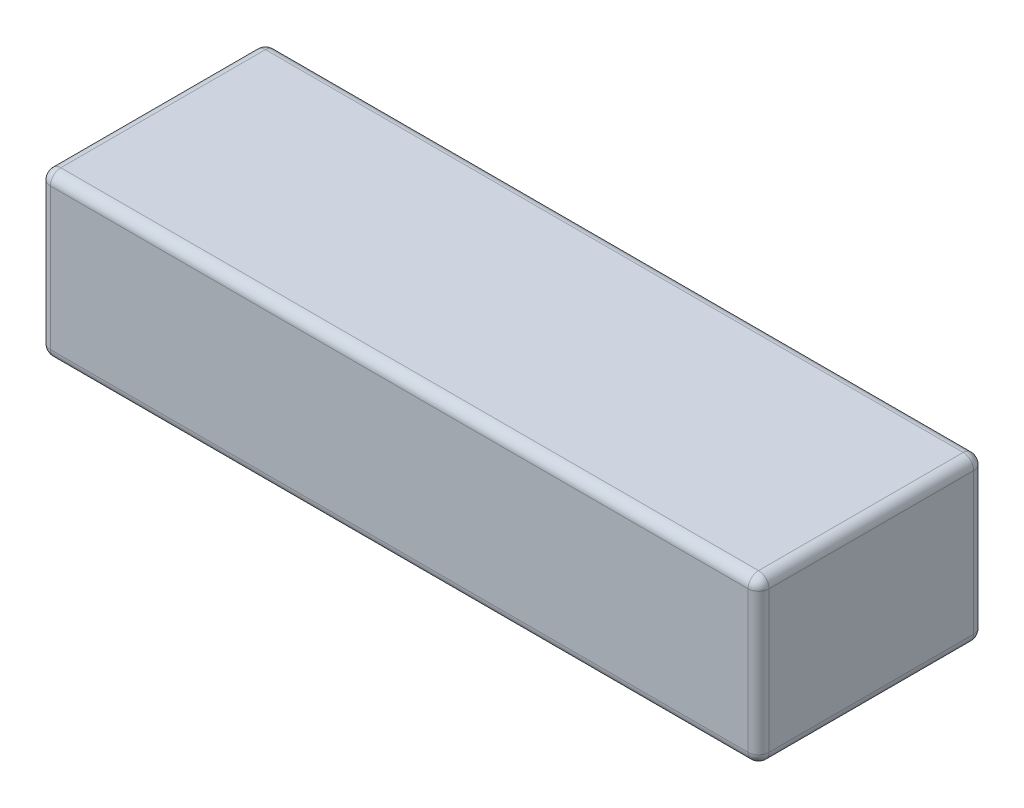
ISO-10303-21;
HEADER;
FILE_DESCRIPTION(('STEP AP214'),'2;1');
FILE_NAME('part.step','',(''),(''),'','','');
FILE_SCHEMA(('AUTOMOTIVE_DESIGN { 1 0 10303 214 1 1 1 1 }'));
ENDSEC;
DATA;
#1=APPLICATION_CONTEXT('core data for automotive mechanical design processes');
#2=APPLICATION_PROTOCOL_DEFINITION('international standard','automotive_design',2000,#1);
#3=PRODUCT_CONTEXT('',#1,'mechanical');
#4=PRODUCT('Part','Part','',(#3));
#5=PRODUCT_RELATED_PRODUCT_CATEGORY('part','',(#4));
#6=PRODUCT_DEFINITION_FORMATION('','',#4);
#7=PRODUCT_DEFINITION_CONTEXT('part definition',#1,'design');
#8=PRODUCT_DEFINITION('design','',#6,#7);
#9=PRODUCT_DEFINITION_SHAPE('','',#8);
#10=(LENGTH_UNIT() NAMED_UNIT(*) SI_UNIT(.MILLI.,.METRE.));
#11=(NAMED_UNIT(*) PLANE_ANGLE_UNIT() SI_UNIT($,.RADIAN.));
#12=(NAMED_UNIT(*) SI_UNIT($,.STERADIAN.) SOLID_ANGLE_UNIT());
#13=UNCERTAINTY_MEASURE_WITH_UNIT(LENGTH_MEASURE(1.E-05),#10,'distance_accuracy_value','');
#14=(GEOMETRIC_REPRESENTATION_CONTEXT(3) GLOBAL_UNCERTAINTY_ASSIGNED_CONTEXT((#13)) GLOBAL_UNIT_ASSIGNED_CONTEXT((#10,
#11,#12)) REPRESENTATION_CONTEXT('',''));
#15=CARTESIAN_POINT('',(0.,0.,0.));
#16=DIRECTION('',(0.,0.,1.));
#17=DIRECTION('',(1.,0.,0.));
#18=AXIS2_PLACEMENT_3D('',#15,#16,#17);
#19=CARTESIAN_POINT('',(0.,31.,0.));
#20=DIRECTION('',(1.,0.,0.));
#21=DIRECTION('',(0.,0.,-1.));
#22=AXIS2_PLACEMENT_3D('',#19,#20,#21);
#23=PLANE('',#22);
#24=DIRECTION('',(0.,-1.,0.));
#25=VECTOR('',#24,1.);
#26=CARTESIAN_POINT('',(0.,31.,-41.));
#27=LINE('',#26,#25);
#28=CARTESIAN_POINT('',(0.,29.,-41.));
#29=VERTEX_POINT('',#28);
#30=CARTESIAN_POINT('',(0.,2.,-41.));
#31=VERTEX_POINT('',#30);
#32=EDGE_CURVE('E186',#29,#31,#27,.T.);
#33=ORIENTED_EDGE('',*,*,#32,.T.);
#34=DIRECTION('',(0.,0.,1.));
#35=VECTOR('',#34,1.);
#36=CARTESIAN_POINT('',(0.,2.,0.));
#37=LINE('',#36,#35);
#38=CARTESIAN_POINT('',(0.,2.,-2.));
#39=VERTEX_POINT('',#38);
#40=EDGE_CURVE('E189',#31,#39,#37,.T.);
#41=ORIENTED_EDGE('',*,*,#40,.T.);
#42=DIRECTION('',(0.,-1.,0.));
#43=VECTOR('',#42,1.);
#44=CARTESIAN_POINT('',(0.,31.,-2.));
#45=LINE('',#44,#43);
#46=CARTESIAN_POINT('',(0.,29.,-2.));
#47=VERTEX_POINT('',#46);
#48=EDGE_CURVE('E184',#39,#47,#45,.F.);
#49=ORIENTED_EDGE('',*,*,#48,.T.);
#50=DIRECTION('',(0.,0.,1.));
#51=VECTOR('',#50,1.);
#52=CARTESIAN_POINT('',(0.,29.,0.));
#53=LINE('',#52,#51);
#54=EDGE_CURVE('E182',#47,#29,#53,.F.);
#55=ORIENTED_EDGE('',*,*,#54,.T.);
#56=EDGE_LOOP('',(#33,#41,#49,#55));
#57=FACE_BOUND('',#56,.T.);
#58=ADVANCED_FACE('F35',(#57),#23,.F.);
#59=CARTESIAN_POINT('',(0.,31.,0.));
#60=DIRECTION('',(0.,0.,-1.));
#61=DIRECTION('',(-1.,0.,0.));
#62=AXIS2_PLACEMENT_3D('',#59,#60,#61);
#63=PLANE('',#62);
#64=DIRECTION('',(0.,-1.,0.));
#65=VECTOR('',#64,1.);
#66=CARTESIAN_POINT('',(2.,31.,0.));
#67=LINE('',#66,#65);
#68=CARTESIAN_POINT('',(2.,29.,0.));
#69=VERTEX_POINT('',#68);
#70=CARTESIAN_POINT('',(2.,2.,0.));
#71=VERTEX_POINT('',#70);
#72=EDGE_CURVE('E168',#69,#71,#67,.T.);
#73=ORIENTED_EDGE('',*,*,#72,.T.);
#74=DIRECTION('',(1.,0.,0.));
#75=VECTOR('',#74,1.);
#76=CARTESIAN_POINT('',(137.,2.,0.));
#77=LINE('',#76,#75);
#78=CARTESIAN_POINT('',(135.,2.,0.));
#79=VERTEX_POINT('',#78);
#80=EDGE_CURVE('E173',#71,#79,#77,.T.);
#81=ORIENTED_EDGE('',*,*,#80,.T.);
#82=DIRECTION('',(0.,-1.,0.));
#83=VECTOR('',#82,1.);
#84=CARTESIAN_POINT('',(135.,31.,0.));
#85=LINE('',#84,#83);
#86=CARTESIAN_POINT('',(135.,29.,0.));
#87=VERTEX_POINT('',#86);
#88=EDGE_CURVE('E170',#79,#87,#85,.F.);
#89=ORIENTED_EDGE('',*,*,#88,.T.);
#90=DIRECTION('',(1.,0.,0.));
#91=VECTOR('',#90,1.);
#92=CARTESIAN_POINT('',(0.,29.,0.));
#93=LINE('',#92,#91);
#94=EDGE_CURVE('E166',#87,#69,#93,.F.);
#95=ORIENTED_EDGE('',*,*,#94,.T.);
#96=EDGE_LOOP('',(#73,#81,#89,#95));
#97=FACE_BOUND('',#96,.T.);
#98=ADVANCED_FACE('F307',(#97),#63,.F.);
#99=CARTESIAN_POINT('',(137.,31.,0.));
#100=DIRECTION('',(-1.,0.,0.));
#101=DIRECTION('',(0.,0.,1.));
#102=AXIS2_PLACEMENT_3D('',#99,#100,#101);
#103=PLANE('',#102);
#104=DIRECTION('',(0.,-1.,0.));
#105=VECTOR('',#104,1.);
#106=CARTESIAN_POINT('',(137.,31.,-2.));
#107=LINE('',#106,#105);
#108=CARTESIAN_POINT('',(137.,29.,-2.));
#109=VERTEX_POINT('',#108);
#110=CARTESIAN_POINT('',(137.,2.,-2.));
#111=VERTEX_POINT('',#110);
#112=EDGE_CURVE('E134',#109,#111,#107,.T.);
#113=ORIENTED_EDGE('',*,*,#112,.T.);
#114=DIRECTION('',(0.,0.,-1.));
#115=VECTOR('',#114,1.);
#116=CARTESIAN_POINT('',(137.,2.,-43.));
#117=LINE('',#116,#115);
#118=CARTESIAN_POINT('',(137.,2.,-41.));
#119=VERTEX_POINT('',#118);
#120=EDGE_CURVE('E130',#111,#119,#117,.T.);
#121=ORIENTED_EDGE('',*,*,#120,.T.);
#122=DIRECTION('',(0.,-1.,0.));
#123=VECTOR('',#122,1.);
#124=CARTESIAN_POINT('',(137.,31.,-41.));
#125=LINE('',#124,#123);
#126=CARTESIAN_POINT('',(137.,29.,-41.));
#127=VERTEX_POINT('',#126);
#128=EDGE_CURVE('E122',#119,#127,#125,.F.);
#129=ORIENTED_EDGE('',*,*,#128,.T.);
#130=DIRECTION('',(0.,0.,-1.));
#131=VECTOR('',#130,1.);
#132=CARTESIAN_POINT('',(137.,29.,0.));
#133=LINE('',#132,#131);
#134=EDGE_CURVE('E127',#127,#109,#133,.F.);
#135=ORIENTED_EDGE('',*,*,#134,.T.);
#136=EDGE_LOOP('',(#113,#121,#129,#135));
#137=FACE_BOUND('',#136,.T.);
#138=ADVANCED_FACE('F125',(#137),#103,.F.);
#139=CARTESIAN_POINT('',(0.,31.,-43.));
#140=DIRECTION('',(0.,0.,1.));
#141=DIRECTION('',(1.,0.,0.));
#142=AXIS2_PLACEMENT_3D('',#139,#140,#141);
#143=PLANE('',#142);
#144=DIRECTION('',(0.,-1.,0.));
#145=VECTOR('',#144,1.);
#146=CARTESIAN_POINT('',(135.,31.,-43.));
#147=LINE('',#146,#145);
#148=CARTESIAN_POINT('',(135.,29.,-43.));
#149=VERTEX_POINT('',#148);
#150=CARTESIAN_POINT('',(135.,2.,-43.));
#151=VERTEX_POINT('',#150);
#152=EDGE_CURVE('E142',#149,#151,#147,.T.);
#153=ORIENTED_EDGE('',*,*,#152,.T.);
#154=DIRECTION('',(-1.,0.,0.));
#155=VECTOR('',#154,1.);
#156=CARTESIAN_POINT('',(0.,2.,-43.));
#157=LINE('',#156,#155);
#158=CARTESIAN_POINT('',(2.,2.,-43.));
#159=VERTEX_POINT('',#158);
#160=EDGE_CURVE('E180',#151,#159,#157,.T.);
#161=ORIENTED_EDGE('',*,*,#160,.T.);
#162=DIRECTION('',(0.,-1.,0.));
#163=VECTOR('',#162,1.);
#164=CARTESIAN_POINT('',(2.,31.,-43.));
#165=LINE('',#164,#163);
#166=CARTESIAN_POINT('',(2.,29.,-43.));
#167=VERTEX_POINT('',#166);
#168=EDGE_CURVE('E177',#159,#167,#165,.F.);
#169=ORIENTED_EDGE('',*,*,#168,.T.);
#170=DIRECTION('',(-1.,0.,0.));
#171=VECTOR('',#170,1.);
#172=CARTESIAN_POINT('',(0.,29.,-43.));
#173=LINE('',#172,#171);
#174=EDGE_CURVE('E175',#167,#149,#173,.F.);
#175=ORIENTED_EDGE('',*,*,#174,.T.);
#176=EDGE_LOOP('',(#153,#161,#169,#175));
#177=FACE_BOUND('',#176,.T.);
#178=ADVANCED_FACE('F298',(#177),#143,.F.);
#179=CARTESIAN_POINT('',(0.,31.,0.));
#180=DIRECTION('',(0.,-1.,0.));
#181=DIRECTION('',(0.,0.,-1.));
#182=AXIS2_PLACEMENT_3D('',#179,#180,#181);
#183=PLANE('',#182);
#184=DIRECTION('',(0.,0.,-1.));
#185=VECTOR('',#184,1.);
#186=CARTESIAN_POINT('',(135.,31.,0.));
#187=LINE('',#186,#185);
#188=CARTESIAN_POINT('',(135.,31.,-2.));
#189=VERTEX_POINT('',#188);
#190=CARTESIAN_POINT('',(135.,31.,-41.));
#191=VERTEX_POINT('',#190);
#192=EDGE_CURVE('E44',#189,#191,#187,.T.);
#193=ORIENTED_EDGE('',*,*,#192,.T.);
#194=DIRECTION('',(-1.,0.,0.));
#195=VECTOR('',#194,1.);
#196=CARTESIAN_POINT('',(0.,31.,-41.));
#197=LINE('',#196,#195);
#198=CARTESIAN_POINT('',(2.,31.,-41.));
#199=VERTEX_POINT('',#198);
#200=EDGE_CURVE('E11',#191,#199,#197,.T.);
#201=ORIENTED_EDGE('',*,*,#200,.T.);
#202=DIRECTION('',(0.,0.,1.));
#203=VECTOR('',#202,1.);
#204=CARTESIAN_POINT('',(2.,31.,0.));
#205=LINE('',#204,#203);
#206=CARTESIAN_POINT('',(2.,31.,-2.));
#207=VERTEX_POINT('',#206);
#208=EDGE_CURVE('E200',#199,#207,#205,.T.);
#209=ORIENTED_EDGE('',*,*,#208,.T.);
#210=DIRECTION('',(1.,0.,0.));
#211=VECTOR('',#210,1.);
#212=CARTESIAN_POINT('',(0.,31.,-2.));
#213=LINE('',#212,#211);
#214=EDGE_CURVE('E55',#207,#189,#213,.T.);
#215=ORIENTED_EDGE('',*,*,#214,.T.);
#216=EDGE_LOOP('',(#193,#201,#209,#215));
#217=FACE_BOUND('',#216,.T.);
#218=ADVANCED_FACE('F300',(#217),#183,.F.);
#219=CARTESIAN_POINT('',(0.,0.,0.));
#220=DIRECTION('',(0.,-1.,0.));
#221=DIRECTION('',(0.,0.,-1.));
#222=AXIS2_PLACEMENT_3D('',#219,#220,#221);
#223=PLANE('',#222);
#224=DIRECTION('',(0.,0.,-1.));
#225=VECTOR('',#224,1.);
#226=CARTESIAN_POINT('',(135.,0.,0.));
#227=LINE('',#226,#225);
#228=CARTESIAN_POINT('',(135.,0.,-41.));
#229=VERTEX_POINT('',#228);
#230=CARTESIAN_POINT('',(135.,0.,-2.));
#231=VERTEX_POINT('',#230);
#232=EDGE_CURVE('E195',#229,#231,#227,.F.);
#233=ORIENTED_EDGE('',*,*,#232,.T.);
#234=DIRECTION('',(1.,0.,0.));
#235=VECTOR('',#234,1.);
#236=CARTESIAN_POINT('',(0.,0.,-2.));
#237=LINE('',#236,#235);
#238=CARTESIAN_POINT('',(2.,0.,-2.));
#239=VERTEX_POINT('',#238);
#240=EDGE_CURVE('E197',#231,#239,#237,.F.);
#241=ORIENTED_EDGE('',*,*,#240,.T.);
#242=DIRECTION('',(0.,0.,1.));
#243=VECTOR('',#242,1.);
#244=CARTESIAN_POINT('',(2.,0.,-43.));
#245=LINE('',#244,#243);
#246=CARTESIAN_POINT('',(2.,0.,-41.));
#247=VERTEX_POINT('',#246);
#248=EDGE_CURVE('E191',#239,#247,#245,.F.);
#249=ORIENTED_EDGE('',*,*,#248,.T.);
#250=DIRECTION('',(-1.,0.,0.));
#251=VECTOR('',#250,1.);
#252=CARTESIAN_POINT('',(137.,0.,-41.));
#253=LINE('',#252,#251);
#254=EDGE_CURVE('E193',#247,#229,#253,.F.);
#255=ORIENTED_EDGE('',*,*,#254,.T.);
#256=EDGE_LOOP('',(#233,#241,#249,#255));
#257=FACE_BOUND('',#256,.T.);
#258=ADVANCED_FACE('F267',(#257),#223,.T.);
#259=CARTESIAN_POINT('',(2.,31.,-41.));
#260=DIRECTION('',(0.,-1.,0.));
#261=DIRECTION('',(0.,0.,-1.));
#262=AXIS2_PLACEMENT_3D('',#259,#260,#261);
#263=CYLINDRICAL_SURFACE('',#262,2.);
#264=CARTESIAN_POINT('',(2.,29.,-41.));
#265=DIRECTION('',(0.,1.,0.));
#266=DIRECTION('',(0.,0.,1.));
#267=AXIS2_PLACEMENT_3D('',#264,#265,#266);
#268=CIRCLE('',#267,2.);
#269=EDGE_CURVE('E39',#167,#29,#268,.T.);
#270=ORIENTED_EDGE('',*,*,#269,.F.);
#271=ORIENTED_EDGE('',*,*,#168,.F.);
#272=CARTESIAN_POINT('',(2.,2.,-41.));
#273=DIRECTION('',(0.,-1.,0.));
#274=DIRECTION('',(0.,0.,-1.));
#275=AXIS2_PLACEMENT_3D('',#272,#273,#274);
#276=CIRCLE('',#275,2.);
#277=EDGE_CURVE('E162',#31,#159,#276,.T.);
#278=ORIENTED_EDGE('',*,*,#277,.F.);
#279=ORIENTED_EDGE('',*,*,#32,.F.);
#280=EDGE_LOOP('',(#270,#271,#278,#279));
#281=FACE_BOUND('',#280,.T.);
#282=ADVANCED_FACE('F37',(#281),#263,.T.);
#283=CARTESIAN_POINT('',(2.,29.,-41.));
#284=DIRECTION('',(-1.,0.,0.));
#285=DIRECTION('',(0.,0.,1.));
#286=AXIS2_PLACEMENT_3D('',#283,#284,#285);
#287=SPHERICAL_SURFACE('',#286,2.);
#288=CARTESIAN_POINT('',(2.,29.,-41.));
#289=DIRECTION('',(-1.,0.,0.));
#290=DIRECTION('',(0.,0.,1.));
#291=AXIS2_PLACEMENT_3D('',#288,#289,#290);
#292=CIRCLE('',#291,2.);
#293=EDGE_CURVE('E246',#167,#199,#292,.F.);
#294=ORIENTED_EDGE('',*,*,#293,.F.);
#295=ORIENTED_EDGE('',*,*,#269,.T.);
#296=CARTESIAN_POINT('',(2.,29.,-41.));
#297=DIRECTION('',(0.,0.,-1.));
#298=DIRECTION('',(-1.,0.,0.));
#299=AXIS2_PLACEMENT_3D('',#296,#297,#298);
#300=CIRCLE('',#299,2.);
#301=EDGE_CURVE('E249',#199,#29,#300,.F.);
#302=ORIENTED_EDGE('',*,*,#301,.F.);
#303=EDGE_LOOP('',(#294,#295,#302));
#304=FACE_BOUND('',#303,.T.);
#305=ADVANCED_FACE('F293',(#304),#287,.T.);
#306=CARTESIAN_POINT('',(2.,2.,-41.));
#307=DIRECTION('',(0.,0.,-1.));
#308=DIRECTION('',(0.,1.,0.));
#309=AXIS2_PLACEMENT_3D('',#306,#307,#308);
#310=SPHERICAL_SURFACE('',#309,2.);
#311=CARTESIAN_POINT('',(2.,2.,-41.));
#312=DIRECTION('',(0.,0.,-1.));
#313=DIRECTION('',(-1.,0.,0.));
#314=AXIS2_PLACEMENT_3D('',#311,#312,#313);
#315=CIRCLE('',#314,2.);
#316=EDGE_CURVE('E240',#31,#247,#315,.F.);
#317=ORIENTED_EDGE('',*,*,#316,.F.);
#318=ORIENTED_EDGE('',*,*,#277,.T.);
#319=CARTESIAN_POINT('',(2.,2.,-41.));
#320=DIRECTION('',(-1.,0.,0.));
#321=DIRECTION('',(0.,0.,1.));
#322=AXIS2_PLACEMENT_3D('',#319,#320,#321);
#323=CIRCLE('',#322,2.);
#324=EDGE_CURVE('E243',#247,#159,#323,.F.);
#325=ORIENTED_EDGE('',*,*,#324,.F.);
#326=EDGE_LOOP('',(#317,#318,#325));
#327=FACE_BOUND('',#326,.T.);
#328=ADVANCED_FACE('F256',(#327),#310,.T.);
#329=CARTESIAN_POINT('',(2.,29.,0.));
#330=DIRECTION('',(0.,0.,1.));
#331=DIRECTION('',(1.,0.,0.));
#332=AXIS2_PLACEMENT_3D('',#329,#330,#331);
#333=CYLINDRICAL_SURFACE('',#332,2.);
#334=ORIENTED_EDGE('',*,*,#301,.T.);
#335=ORIENTED_EDGE('',*,*,#54,.F.);
#336=CARTESIAN_POINT('',(2.,29.,-2.));
#337=DIRECTION('',(0.,0.,1.));
#338=DIRECTION('',(1.,0.,0.));
#339=AXIS2_PLACEMENT_3D('',#336,#337,#338);
#340=CIRCLE('',#339,2.);
#341=EDGE_CURVE('E234',#207,#47,#340,.T.);
#342=ORIENTED_EDGE('',*,*,#341,.F.);
#343=ORIENTED_EDGE('',*,*,#208,.F.);
#344=EDGE_LOOP('',(#334,#335,#342,#343));
#345=FACE_BOUND('',#344,.T.);
#346=ADVANCED_FACE('F288',(#345),#333,.T.);
#347=CARTESIAN_POINT('',(0.,29.,-41.));
#348=DIRECTION('',(-1.,0.,0.));
#349=DIRECTION('',(0.,0.,1.));
#350=AXIS2_PLACEMENT_3D('',#347,#348,#349);
#351=CYLINDRICAL_SURFACE('',#350,2.);
#352=ORIENTED_EDGE('',*,*,#293,.T.);
#353=ORIENTED_EDGE('',*,*,#200,.F.);
#354=CARTESIAN_POINT('',(135.,29.,-41.));
#355=DIRECTION('',(1.,0.,0.));
#356=DIRECTION('',(0.,0.,-1.));
#357=AXIS2_PLACEMENT_3D('',#354,#355,#356);
#358=CIRCLE('',#357,2.);
#359=EDGE_CURVE('E146',#149,#191,#358,.T.);
#360=ORIENTED_EDGE('',*,*,#359,.F.);
#361=ORIENTED_EDGE('',*,*,#174,.F.);
#362=EDGE_LOOP('',(#352,#353,#360,#361));
#363=FACE_BOUND('',#362,.T.);
#364=ADVANCED_FACE('F296',(#363),#351,.T.);
#365=CARTESIAN_POINT('',(135.,31.,-41.));
#366=DIRECTION('',(0.,-1.,0.));
#367=DIRECTION('',(0.,0.,-1.));
#368=AXIS2_PLACEMENT_3D('',#365,#366,#367);
#369=CYLINDRICAL_SURFACE('',#368,2.);
#370=CARTESIAN_POINT('',(135.,2.,-41.));
#371=DIRECTION('',(0.,-1.,0.));
#372=DIRECTION('',(0.,0.,-1.));
#373=AXIS2_PLACEMENT_3D('',#370,#371,#372);
#374=CIRCLE('',#373,2.);
#375=EDGE_CURVE('E147',#151,#119,#374,.T.);
#376=ORIENTED_EDGE('',*,*,#375,.F.);
#377=ORIENTED_EDGE('',*,*,#152,.F.);
#378=CARTESIAN_POINT('',(135.,29.,-41.));
#379=DIRECTION('',(0.,1.,0.));
#380=DIRECTION('',(0.,0.,1.));
#381=AXIS2_PLACEMENT_3D('',#378,#379,#380);
#382=CIRCLE('',#381,2.);
#383=EDGE_CURVE('E138',#127,#149,#382,.T.);
#384=ORIENTED_EDGE('',*,*,#383,.F.);
#385=ORIENTED_EDGE('',*,*,#128,.F.);
#386=EDGE_LOOP('',(#376,#377,#384,#385));
#387=FACE_BOUND('',#386,.T.);
#388=ADVANCED_FACE('F140',(#387),#369,.T.);
#389=CARTESIAN_POINT('',(0.,2.,-41.));
#390=DIRECTION('',(1.,0.,0.));
#391=DIRECTION('',(0.,0.,-1.));
#392=AXIS2_PLACEMENT_3D('',#389,#390,#391);
#393=CYLINDRICAL_SURFACE('',#392,2.);
#394=ORIENTED_EDGE('',*,*,#324,.T.);
#395=ORIENTED_EDGE('',*,*,#160,.F.);
#396=CARTESIAN_POINT('',(135.,2.,-41.));
#397=DIRECTION('',(1.,0.,0.));
#398=DIRECTION('',(0.,0.,-1.));
#399=AXIS2_PLACEMENT_3D('',#396,#397,#398);
#400=CIRCLE('',#399,2.);
#401=EDGE_CURVE('E230',#229,#151,#400,.T.);
#402=ORIENTED_EDGE('',*,*,#401,.F.);
#403=ORIENTED_EDGE('',*,*,#254,.F.);
#404=EDGE_LOOP('',(#394,#395,#402,#403));
#405=FACE_BOUND('',#404,.T.);
#406=ADVANCED_FACE('F263',(#405),#393,.T.);
#407=CARTESIAN_POINT('',(2.,2.,0.));
#408=DIRECTION('',(0.,0.,-1.));
#409=DIRECTION('',(-1.,0.,0.));
#410=AXIS2_PLACEMENT_3D('',#407,#408,#409);
#411=CYLINDRICAL_SURFACE('',#410,2.);
#412=ORIENTED_EDGE('',*,*,#316,.T.);
#413=ORIENTED_EDGE('',*,*,#248,.F.);
#414=CARTESIAN_POINT('',(2.,2.,-2.));
#415=DIRECTION('',(0.,0.,1.));
#416=DIRECTION('',(1.,0.,0.));
#417=AXIS2_PLACEMENT_3D('',#414,#415,#416);
#418=CIRCLE('',#417,2.);
#419=EDGE_CURVE('E227',#39,#239,#418,.T.);
#420=ORIENTED_EDGE('',*,*,#419,.F.);
#421=ORIENTED_EDGE('',*,*,#40,.F.);
#422=EDGE_LOOP('',(#412,#413,#420,#421));
#423=FACE_BOUND('',#422,.T.);
#424=ADVANCED_FACE('F273',(#423),#411,.T.);
#425=CARTESIAN_POINT('',(2.,31.,-2.));
#426=DIRECTION('',(0.,-1.,0.));
#427=DIRECTION('',(0.,0.,-1.));
#428=AXIS2_PLACEMENT_3D('',#425,#426,#427);
#429=CYLINDRICAL_SURFACE('',#428,2.);
#430=CARTESIAN_POINT('',(2.,29.,-2.));
#431=DIRECTION('',(0.,1.,0.));
#432=DIRECTION('',(0.,0.,1.));
#433=AXIS2_PLACEMENT_3D('',#430,#431,#432);
#434=CIRCLE('',#433,2.);
#435=EDGE_CURVE('E237',#47,#69,#434,.T.);
#436=ORIENTED_EDGE('',*,*,#435,.F.);
#437=ORIENTED_EDGE('',*,*,#48,.F.);
#438=CARTESIAN_POINT('',(2.,2.,-2.));
#439=DIRECTION('',(0.,-1.,0.));
#440=DIRECTION('',(0.,0.,-1.));
#441=AXIS2_PLACEMENT_3D('',#438,#439,#440);
#442=CIRCLE('',#441,2.);
#443=EDGE_CURVE('E224',#71,#39,#442,.T.);
#444=ORIENTED_EDGE('',*,*,#443,.F.);
#445=ORIENTED_EDGE('',*,*,#72,.F.);
#446=EDGE_LOOP('',(#436,#437,#444,#445));
#447=FACE_BOUND('',#446,.T.);
#448=ADVANCED_FACE('F280',(#447),#429,.T.);
#449=CARTESIAN_POINT('',(2.,29.,-2.));
#450=DIRECTION('',(-1.,0.,0.));
#451=DIRECTION('',(0.,0.,1.));
#452=AXIS2_PLACEMENT_3D('',#449,#450,#451);
#453=SPHERICAL_SURFACE('',#452,2.);
#454=ORIENTED_EDGE('',*,*,#341,.T.);
#455=ORIENTED_EDGE('',*,*,#435,.T.);
#456=CARTESIAN_POINT('',(2.,29.,-2.));
#457=DIRECTION('',(-1.,0.,0.));
#458=DIRECTION('',(0.,0.,1.));
#459=AXIS2_PLACEMENT_3D('',#456,#457,#458);
#460=CIRCLE('',#459,2.);
#461=EDGE_CURVE('E153',#207,#69,#460,.F.);
#462=ORIENTED_EDGE('',*,*,#461,.F.);
#463=EDGE_LOOP('',(#454,#455,#462));
#464=FACE_BOUND('',#463,.T.);
#465=ADVANCED_FACE('F286',(#464),#453,.T.);
#466=CARTESIAN_POINT('',(135.,29.,-41.));
#467=DIRECTION('',(0.,0.,-1.));
#468=DIRECTION('',(-1.,0.,0.));
#469=AXIS2_PLACEMENT_3D('',#466,#467,#468);
#470=SPHERICAL_SURFACE('',#469,2.);
#471=ORIENTED_EDGE('',*,*,#383,.T.);
#472=ORIENTED_EDGE('',*,*,#359,.T.);
#473=CARTESIAN_POINT('',(135.,29.,-41.));
#474=DIRECTION('',(0.,0.,-1.));
#475=DIRECTION('',(-1.,0.,0.));
#476=AXIS2_PLACEMENT_3D('',#473,#474,#475);
#477=CIRCLE('',#476,2.);
#478=EDGE_CURVE('E150',#127,#191,#477,.F.);
#479=ORIENTED_EDGE('',*,*,#478,.F.);
#480=EDGE_LOOP('',(#471,#472,#479));
#481=FACE_BOUND('',#480,.T.);
#482=ADVANCED_FACE('F151',(#481),#470,.T.);
#483=CARTESIAN_POINT('',(135.,2.,-41.));
#484=DIRECTION('',(0.,0.,-1.));
#485=DIRECTION('',(0.,1.,0.));
#486=AXIS2_PLACEMENT_3D('',#483,#484,#485);
#487=SPHERICAL_SURFACE('',#486,2.);
#488=ORIENTED_EDGE('',*,*,#401,.T.);
#489=ORIENTED_EDGE('',*,*,#375,.T.);
#490=CARTESIAN_POINT('',(135.,2.,-41.));
#491=DIRECTION('',(0.,0.,-1.));
#492=DIRECTION('',(-1.,0.,0.));
#493=AXIS2_PLACEMENT_3D('',#490,#491,#492);
#494=CIRCLE('',#493,2.);
#495=EDGE_CURVE('E154',#229,#119,#494,.F.);
#496=ORIENTED_EDGE('',*,*,#495,.F.);
#497=EDGE_LOOP('',(#488,#489,#496));
#498=FACE_BOUND('',#497,.T.);
#499=ADVANCED_FACE('F347',(#498),#487,.T.);
#500=CARTESIAN_POINT('',(2.,2.,-2.));
#501=DIRECTION('',(-1.,0.,0.));
#502=DIRECTION('',(0.,-1.,0.));
#503=AXIS2_PLACEMENT_3D('',#500,#501,#502);
#504=SPHERICAL_SURFACE('',#503,2.);
#505=ORIENTED_EDGE('',*,*,#443,.T.);
#506=ORIENTED_EDGE('',*,*,#419,.T.);
#507=CARTESIAN_POINT('',(2.,2.,-2.));
#508=DIRECTION('',(-1.,0.,0.));
#509=DIRECTION('',(0.,0.,1.));
#510=AXIS2_PLACEMENT_3D('',#507,#508,#509);
#511=CIRCLE('',#510,2.);
#512=EDGE_CURVE('E218',#71,#239,#511,.F.);
#513=ORIENTED_EDGE('',*,*,#512,.F.);
#514=EDGE_LOOP('',(#505,#506,#513));
#515=FACE_BOUND('',#514,.T.);
#516=ADVANCED_FACE('F343',(#515),#504,.T.);
#517=CARTESIAN_POINT('',(0.,29.,-2.));
#518=DIRECTION('',(1.,0.,0.));
#519=DIRECTION('',(0.,0.,-1.));
#520=AXIS2_PLACEMENT_3D('',#517,#518,#519);
#521=CYLINDRICAL_SURFACE('',#520,2.);
#522=ORIENTED_EDGE('',*,*,#461,.T.);
#523=ORIENTED_EDGE('',*,*,#94,.F.);
#524=CARTESIAN_POINT('',(135.,29.,-2.));
#525=DIRECTION('',(1.,0.,0.));
#526=DIRECTION('',(0.,0.,-1.));
#527=AXIS2_PLACEMENT_3D('',#524,#525,#526);
#528=CIRCLE('',#527,2.);
#529=EDGE_CURVE('E215',#189,#87,#528,.T.);
#530=ORIENTED_EDGE('',*,*,#529,.F.);
#531=ORIENTED_EDGE('',*,*,#214,.F.);
#532=EDGE_LOOP('',(#522,#523,#530,#531));
#533=FACE_BOUND('',#532,.T.);
#534=ADVANCED_FACE('F340',(#533),#521,.T.);
#535=CARTESIAN_POINT('',(135.,29.,0.));
#536=DIRECTION('',(0.,0.,-1.));
#537=DIRECTION('',(-1.,0.,0.));
#538=AXIS2_PLACEMENT_3D('',#535,#536,#537);
#539=CYLINDRICAL_SURFACE('',#538,2.);
#540=ORIENTED_EDGE('',*,*,#478,.T.);
#541=ORIENTED_EDGE('',*,*,#192,.F.);
#542=CARTESIAN_POINT('',(135.,29.,-2.));
#543=DIRECTION('',(0.,0.,1.));
#544=DIRECTION('',(1.,0.,0.));
#545=AXIS2_PLACEMENT_3D('',#542,#543,#544);
#546=CIRCLE('',#545,2.);
#547=EDGE_CURVE('E158',#109,#189,#546,.T.);
#548=ORIENTED_EDGE('',*,*,#547,.F.);
#549=ORIENTED_EDGE('',*,*,#134,.F.);
#550=EDGE_LOOP('',(#540,#541,#548,#549));
#551=FACE_BOUND('',#550,.T.);
#552=ADVANCED_FACE('F156',(#551),#539,.T.);
#553=CARTESIAN_POINT('',(135.,2.,0.));
#554=DIRECTION('',(0.,0.,1.));
#555=DIRECTION('',(1.,0.,0.));
#556=AXIS2_PLACEMENT_3D('',#553,#554,#555);
#557=CYLINDRICAL_SURFACE('',#556,2.);
#558=ORIENTED_EDGE('',*,*,#495,.T.);
#559=ORIENTED_EDGE('',*,*,#120,.F.);
#560=CARTESIAN_POINT('',(135.,2.,-2.));
#561=DIRECTION('',(0.,0.,1.));
#562=DIRECTION('',(1.,0.,0.));
#563=AXIS2_PLACEMENT_3D('',#560,#561,#562);
#564=CIRCLE('',#563,2.);
#565=EDGE_CURVE('E211',#231,#111,#564,.T.);
#566=ORIENTED_EDGE('',*,*,#565,.F.);
#567=ORIENTED_EDGE('',*,*,#232,.F.);
#568=EDGE_LOOP('',(#558,#559,#566,#567));
#569=FACE_BOUND('',#568,.T.);
#570=ADVANCED_FACE('F333',(#569),#557,.T.);
#571=CARTESIAN_POINT('',(0.,2.,-2.));
#572=DIRECTION('',(-1.,0.,0.));
#573=DIRECTION('',(0.,0.,1.));
#574=AXIS2_PLACEMENT_3D('',#571,#572,#573);
#575=CYLINDRICAL_SURFACE('',#574,2.);
#576=ORIENTED_EDGE('',*,*,#512,.T.);
#577=ORIENTED_EDGE('',*,*,#240,.F.);
#578=CARTESIAN_POINT('',(135.,2.,-2.));
#579=DIRECTION('',(1.,0.,0.));
#580=DIRECTION('',(0.,0.,-1.));
#581=AXIS2_PLACEMENT_3D('',#578,#579,#580);
#582=CIRCLE('',#581,2.);
#583=EDGE_CURVE('E208',#79,#231,#582,.T.);
#584=ORIENTED_EDGE('',*,*,#583,.F.);
#585=ORIENTED_EDGE('',*,*,#80,.F.);
#586=EDGE_LOOP('',(#576,#577,#584,#585));
#587=FACE_BOUND('',#586,.T.);
#588=ADVANCED_FACE('F329',(#587),#575,.T.);
#589=CARTESIAN_POINT('',(135.,29.,-2.));
#590=DIRECTION('',(0.,1.,0.));
#591=DIRECTION('',(0.,0.,1.));
#592=AXIS2_PLACEMENT_3D('',#589,#590,#591);
#593=SPHERICAL_SURFACE('',#592,2.);
#594=ORIENTED_EDGE('',*,*,#547,.T.);
#595=ORIENTED_EDGE('',*,*,#529,.T.);
#596=CARTESIAN_POINT('',(135.,29.,-2.));
#597=DIRECTION('',(0.,1.,0.));
#598=DIRECTION('',(0.,0.,1.));
#599=AXIS2_PLACEMENT_3D('',#596,#597,#598);
#600=CIRCLE('',#599,2.);
#601=EDGE_CURVE('E206',#109,#87,#600,.F.);
#602=ORIENTED_EDGE('',*,*,#601,.F.);
#603=EDGE_LOOP('',(#594,#595,#602));
#604=FACE_BOUND('',#603,.T.);
#605=ADVANCED_FACE('F325',(#604),#593,.T.);
#606=CARTESIAN_POINT('',(135.,2.,-2.));
#607=DIRECTION('',(0.,-1.,0.));
#608=DIRECTION('',(0.,0.,-1.));
#609=AXIS2_PLACEMENT_3D('',#606,#607,#608);
#610=SPHERICAL_SURFACE('',#609,2.);
#611=ORIENTED_EDGE('',*,*,#583,.T.);
#612=ORIENTED_EDGE('',*,*,#565,.T.);
#613=CARTESIAN_POINT('',(135.,2.,-2.));
#614=DIRECTION('',(0.,-1.,0.));
#615=DIRECTION('',(0.,0.,-1.));
#616=AXIS2_PLACEMENT_3D('',#613,#614,#615);
#617=CIRCLE('',#616,2.);
#618=EDGE_CURVE('E204',#79,#111,#617,.F.);
#619=ORIENTED_EDGE('',*,*,#618,.F.);
#620=EDGE_LOOP('',(#611,#612,#619));
#621=FACE_BOUND('',#620,.T.);
#622=ADVANCED_FACE('F321',(#621),#610,.T.);
#623=CARTESIAN_POINT('',(135.,31.,-2.));
#624=DIRECTION('',(0.,-1.,0.));
#625=DIRECTION('',(0.,0.,-1.));
#626=AXIS2_PLACEMENT_3D('',#623,#624,#625);
#627=CYLINDRICAL_SURFACE('',#626,2.);
#628=ORIENTED_EDGE('',*,*,#601,.T.);
#629=ORIENTED_EDGE('',*,*,#88,.F.);
#630=ORIENTED_EDGE('',*,*,#618,.T.);
#631=ORIENTED_EDGE('',*,*,#112,.F.);
#632=EDGE_LOOP('',(#628,#629,#630,#631));
#633=FACE_BOUND('',#632,.T.);
#634=ADVANCED_FACE('F318',(#633),#627,.T.);
#635=CLOSED_SHELL('',(#58,#98,#138,#178,#218,#258,#282,#305,#328,#346,#364,#388,#406,#424,#448,
#465,#482,#499,#516,#534,#552,#570,#588,#605,#622,#634));
#636=MANIFOLD_SOLID_BREP('B2',#635);
#637=ADVANCED_BREP_SHAPE_REPRESENTATION('',(#18,#636),#14);
#638=SHAPE_DEFINITION_REPRESENTATION(#9,#637);
ENDSEC;
END-ISO-10303-21;
